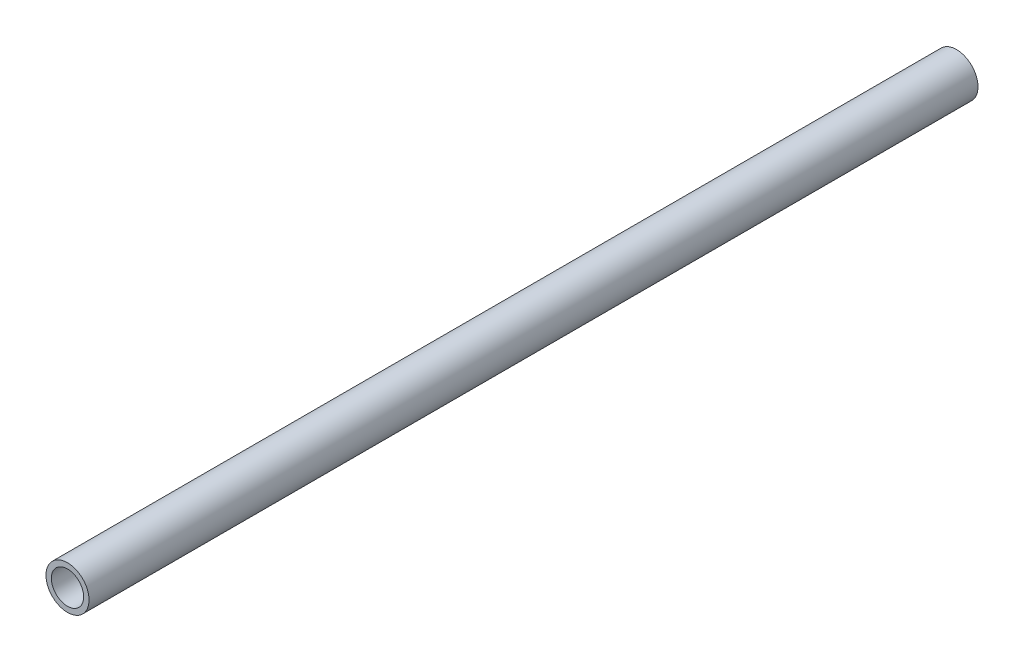
ISO-10303-21;
HEADER;
FILE_DESCRIPTION(('STEP AP214'),'2;1');
FILE_NAME('part.step','',(''),(''),'','','');
FILE_SCHEMA(('AUTOMOTIVE_DESIGN { 1 0 10303 214 1 1 1 1 }'));
ENDSEC;
DATA;
#1=APPLICATION_CONTEXT('core data for automotive mechanical design processes');
#2=APPLICATION_PROTOCOL_DEFINITION('international standard','automotive_design',2000,#1);
#3=PRODUCT_CONTEXT('',#1,'mechanical');
#4=PRODUCT('Part','Part','',(#3));
#5=PRODUCT_RELATED_PRODUCT_CATEGORY('part','',(#4));
#6=PRODUCT_DEFINITION_FORMATION('','',#4);
#7=PRODUCT_DEFINITION_CONTEXT('part definition',#1,'design');
#8=PRODUCT_DEFINITION('design','',#6,#7);
#9=PRODUCT_DEFINITION_SHAPE('','',#8);
#10=(LENGTH_UNIT() NAMED_UNIT(*) SI_UNIT(.MILLI.,.METRE.));
#11=(NAMED_UNIT(*) PLANE_ANGLE_UNIT() SI_UNIT($,.RADIAN.));
#12=(NAMED_UNIT(*) SI_UNIT($,.STERADIAN.) SOLID_ANGLE_UNIT());
#13=UNCERTAINTY_MEASURE_WITH_UNIT(LENGTH_MEASURE(1.E-05),#10,'distance_accuracy_value','');
#14=(GEOMETRIC_REPRESENTATION_CONTEXT(3) GLOBAL_UNCERTAINTY_ASSIGNED_CONTEXT((#13)) GLOBAL_UNIT_ASSIGNED_CONTEXT((#10,
#11,#12)) REPRESENTATION_CONTEXT('',''));
#15=CARTESIAN_POINT('',(0.,0.,0.));
#16=DIRECTION('',(0.,0.,1.));
#17=DIRECTION('',(1.,0.,0.));
#18=AXIS2_PLACEMENT_3D('',#15,#16,#17);
#19=CARTESIAN_POINT('',(0.,0.,1651.));
#20=DIRECTION('',(0.,0.,-1.));
#21=DIRECTION('',(-1.,0.,0.));
#22=AXIS2_PLACEMENT_3D('',#19,#20,#21);
#23=CYLINDRICAL_SURFACE('',#22,30.);
#24=CARTESIAN_POINT('',(0.,0.,1651.));
#25=DIRECTION('',(0.,0.,1.));
#26=DIRECTION('',(1.,0.,0.));
#27=AXIS2_PLACEMENT_3D('',#24,#25,#26);
#28=CIRCLE('',#27,30.);
#29=CARTESIAN_POINT('',(30.,0.,1651.));
#30=VERTEX_POINT('',#29);
#31=EDGE_CURVE('E44',#30,#30,#28,.T.);
#32=ORIENTED_EDGE('',*,*,#31,.T.);
#33=EDGE_LOOP('',(#32));
#34=FACE_BOUND('',#33,.T.);
#35=CARTESIAN_POINT('',(0.,0.,0.));
#36=DIRECTION('',(0.,0.,1.));
#37=DIRECTION('',(1.,0.,0.));
#38=AXIS2_PLACEMENT_3D('',#35,#36,#37);
#39=CIRCLE('',#38,30.);
#40=CARTESIAN_POINT('',(30.,0.,0.));
#41=VERTEX_POINT('',#40);
#42=EDGE_CURVE('E50',#41,#41,#39,.T.);
#43=ORIENTED_EDGE('',*,*,#42,.F.);
#44=EDGE_LOOP('',(#43));
#45=FACE_BOUND('',#44,.T.);
#46=ADVANCED_FACE('F37',(#34,#45),#23,.F.);
#47=CARTESIAN_POINT('',(0.,0.,1651.));
#48=DIRECTION('',(0.,0.,-1.));
#49=DIRECTION('',(-1.,0.,0.));
#50=AXIS2_PLACEMENT_3D('',#47,#48,#49);
#51=CYLINDRICAL_SURFACE('',#50,40.);
#52=CARTESIAN_POINT('',(0.,0.,1651.));
#53=DIRECTION('',(0.,0.,1.));
#54=DIRECTION('',(1.,0.,0.));
#55=AXIS2_PLACEMENT_3D('',#52,#53,#54);
#56=CIRCLE('',#55,40.);
#57=CARTESIAN_POINT('',(40.,0.,1651.));
#58=VERTEX_POINT('',#57);
#59=EDGE_CURVE('E10',#58,#58,#56,.T.);
#60=ORIENTED_EDGE('',*,*,#59,.F.);
#61=EDGE_LOOP('',(#60));
#62=FACE_BOUND('',#61,.T.);
#63=CARTESIAN_POINT('',(0.,0.,0.));
#64=DIRECTION('',(0.,0.,1.));
#65=DIRECTION('',(1.,0.,0.));
#66=AXIS2_PLACEMENT_3D('',#63,#64,#65);
#67=CIRCLE('',#66,40.);
#68=CARTESIAN_POINT('',(40.,0.,0.));
#69=VERTEX_POINT('',#68);
#70=EDGE_CURVE('E40',#69,#69,#67,.T.);
#71=ORIENTED_EDGE('',*,*,#70,.T.);
#72=EDGE_LOOP('',(#71));
#73=FACE_BOUND('',#72,.T.);
#74=ADVANCED_FACE('F57',(#62,#73),#51,.T.);
#75=CARTESIAN_POINT('',(0.,0.,1651.));
#76=DIRECTION('',(0.,0.,1.));
#77=DIRECTION('',(1.,0.,0.));
#78=AXIS2_PLACEMENT_3D('',#75,#76,#77);
#79=PLANE('',#78);
#80=ORIENTED_EDGE('',*,*,#31,.F.);
#81=EDGE_LOOP('',(#80));
#82=FACE_BOUND('',#81,.T.);
#83=ORIENTED_EDGE('',*,*,#59,.T.);
#84=EDGE_LOOP('',(#83));
#85=FACE_BOUND('',#84,.T.);
#86=ADVANCED_FACE('F61',(#82,#85),#79,.T.);
#87=CARTESIAN_POINT('',(0.,0.,0.));
#88=DIRECTION('',(0.,0.,1.));
#89=DIRECTION('',(1.,0.,0.));
#90=AXIS2_PLACEMENT_3D('',#87,#88,#89);
#91=PLANE('',#90);
#92=ORIENTED_EDGE('',*,*,#42,.T.);
#93=EDGE_LOOP('',(#92));
#94=FACE_BOUND('',#93,.T.);
#95=ORIENTED_EDGE('',*,*,#70,.F.);
#96=EDGE_LOOP('',(#95));
#97=FACE_BOUND('',#96,.T.);
#98=ADVANCED_FACE('F59',(#94,#97),#91,.F.);
#99=CLOSED_SHELL('',(#46,#74,#86,#98));
#100=MANIFOLD_SOLID_BREP('B2',#99);
#101=ADVANCED_BREP_SHAPE_REPRESENTATION('',(#18,#100),#14);
#102=SHAPE_DEFINITION_REPRESENTATION(#9,#101);
ENDSEC;
END-ISO-10303-21;
